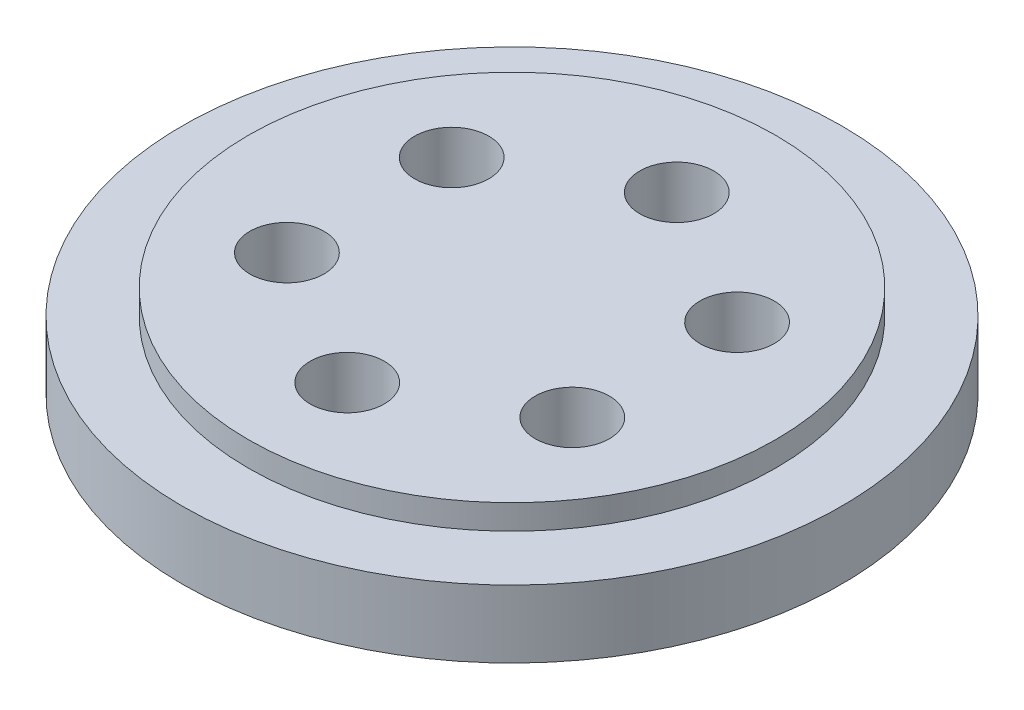
ISO-10303-21;
HEADER;
FILE_DESCRIPTION(('STEP AP214'),'2;1');
FILE_NAME('part.step','',(''),(''),'','','');
FILE_SCHEMA(('AUTOMOTIVE_DESIGN { 1 0 10303 214 1 1 1 1 }'));
ENDSEC;
DATA;
#1=APPLICATION_CONTEXT('core data for automotive mechanical design processes');
#2=APPLICATION_PROTOCOL_DEFINITION('international standard','automotive_design',2000,#1);
#3=PRODUCT_CONTEXT('',#1,'mechanical');
#4=PRODUCT('Part','Part','',(#3));
#5=PRODUCT_RELATED_PRODUCT_CATEGORY('part','',(#4));
#6=PRODUCT_DEFINITION_FORMATION('','',#4);
#7=PRODUCT_DEFINITION_CONTEXT('part definition',#1,'design');
#8=PRODUCT_DEFINITION('design','',#6,#7);
#9=PRODUCT_DEFINITION_SHAPE('','',#8);
#10=(LENGTH_UNIT() NAMED_UNIT(*) SI_UNIT(.MILLI.,.METRE.));
#11=(NAMED_UNIT(*) PLANE_ANGLE_UNIT() SI_UNIT($,.RADIAN.));
#12=(NAMED_UNIT(*) SI_UNIT($,.STERADIAN.) SOLID_ANGLE_UNIT());
#13=UNCERTAINTY_MEASURE_WITH_UNIT(LENGTH_MEASURE(1.E-05),#10,'distance_accuracy_value','');
#14=(GEOMETRIC_REPRESENTATION_CONTEXT(3) GLOBAL_UNCERTAINTY_ASSIGNED_CONTEXT((#13)) GLOBAL_UNIT_ASSIGNED_CONTEXT((#10,
#11,#12)) REPRESENTATION_CONTEXT('',''));
#15=CARTESIAN_POINT('',(0.,0.,0.));
#16=DIRECTION('',(0.,0.,1.));
#17=DIRECTION('',(1.,0.,0.));
#18=AXIS2_PLACEMENT_3D('',#15,#16,#17);
#19=CARTESIAN_POINT('',(0.,5.6,0.));
#20=DIRECTION('',(0.,-1.,0.));
#21=DIRECTION('',(0.,0.,-1.));
#22=AXIS2_PLACEMENT_3D('',#19,#20,#21);
#23=CYLINDRICAL_SURFACE('',#22,20.);
#24=CARTESIAN_POINT('',(0.,0.,0.));
#25=DIRECTION('',(0.,1.,0.));
#26=DIRECTION('',(0.,0.,1.));
#27=AXIS2_PLACEMENT_3D('',#24,#25,#26);
#28=CIRCLE('',#27,20.);
#29=CARTESIAN_POINT('',(0.,0.,20.));
#30=VERTEX_POINT('',#29);
#31=EDGE_CURVE('E10',#30,#30,#28,.T.);
#32=ORIENTED_EDGE('',*,*,#31,.T.);
#33=EDGE_LOOP('',(#32));
#34=FACE_BOUND('',#33,.T.);
#35=CARTESIAN_POINT('',(0.,4.1,0.));
#36=DIRECTION('',(0.,1.,0.));
#37=DIRECTION('',(0.,0.,1.));
#38=AXIS2_PLACEMENT_3D('',#35,#36,#37);
#39=CIRCLE('',#38,20.);
#40=CARTESIAN_POINT('',(0.,4.1,20.));
#41=VERTEX_POINT('',#40);
#42=EDGE_CURVE('E50',#41,#41,#39,.T.);
#43=ORIENTED_EDGE('',*,*,#42,.F.);
#44=EDGE_LOOP('',(#43));
#45=FACE_BOUND('',#44,.T.);
#46=ADVANCED_FACE('F43',(#34,#45),#23,.T.);
#47=CARTESIAN_POINT('',(0.,0.,0.));
#48=DIRECTION('',(0.,1.,0.));
#49=DIRECTION('',(0.,0.,1.));
#50=AXIS2_PLACEMENT_3D('',#47,#48,#49);
#51=PLANE('',#50);
#52=CARTESIAN_POINT('',(0.,0.,-10.));
#53=DIRECTION('',(0.,1.,0.));
#54=DIRECTION('',(0.,0.,1.));
#55=AXIS2_PLACEMENT_3D('',#52,#53,#54);
#56=CIRCLE('',#55,2.25);
#57=CARTESIAN_POINT('',(0.,0.,-7.75));
#58=VERTEX_POINT('',#57);
#59=EDGE_CURVE('E106',#58,#58,#56,.T.);
#60=ORIENTED_EDGE('',*,*,#59,.T.);
#61=EDGE_LOOP('',(#60));
#62=FACE_BOUND('',#61,.T.);
#63=CARTESIAN_POINT('',(8.66025403784467,0.,-5.00000000000049));
#64=DIRECTION('',(0.,1.,0.));
#65=DIRECTION('',(0.,0.,1.));
#66=AXIS2_PLACEMENT_3D('',#63,#64,#65);
#67=CIRCLE('',#66,2.25);
#68=CARTESIAN_POINT('',(8.66025403784467,0.,-2.75000000000049));
#69=VERTEX_POINT('',#68);
#70=EDGE_CURVE('E98',#69,#69,#67,.T.);
#71=ORIENTED_EDGE('',*,*,#70,.T.);
#72=EDGE_LOOP('',(#71));
#73=FACE_BOUND('',#72,.T.);
#74=CARTESIAN_POINT('',(8.66025403784524,0.,4.99999999999951));
#75=DIRECTION('',(0.,1.,0.));
#76=DIRECTION('',(0.,0.,1.));
#77=AXIS2_PLACEMENT_3D('',#74,#75,#76);
#78=CIRCLE('',#77,2.25);
#79=CARTESIAN_POINT('',(8.66025403784524,0.,7.24999999999951));
#80=VERTEX_POINT('',#79);
#81=EDGE_CURVE('E90',#80,#80,#78,.T.);
#82=ORIENTED_EDGE('',*,*,#81,.T.);
#83=EDGE_LOOP('',(#82));
#84=FACE_BOUND('',#83,.T.);
#85=CARTESIAN_POINT('',(1.13319443681872E-12,0.,10.));
#86=DIRECTION('',(0.,1.,0.));
#87=DIRECTION('',(0.,0.,1.));
#88=AXIS2_PLACEMENT_3D('',#85,#86,#87);
#89=CIRCLE('',#88,2.25);
#90=CARTESIAN_POINT('',(1.13319443681872E-12,0.,12.25));
#91=VERTEX_POINT('',#90);
#92=EDGE_CURVE('E82',#91,#91,#89,.T.);
#93=ORIENTED_EDGE('',*,*,#92,.T.);
#94=EDGE_LOOP('',(#93));
#95=FACE_BOUND('',#94,.T.);
#96=CARTESIAN_POINT('',(-8.66025403784354,0.,5.00000000000049));
#97=DIRECTION('',(0.,1.,0.));
#98=DIRECTION('',(0.,0.,1.));
#99=AXIS2_PLACEMENT_3D('',#96,#97,#98);
#100=CIRCLE('',#99,2.25);
#101=CARTESIAN_POINT('',(-8.66025403784354,0.,7.25000000000049));
#102=VERTEX_POINT('',#101);
#103=EDGE_CURVE('E74',#102,#102,#100,.T.);
#104=ORIENTED_EDGE('',*,*,#103,.T.);
#105=EDGE_LOOP('',(#104));
#106=FACE_BOUND('',#105,.T.);
#107=CARTESIAN_POINT('',(-8.6602540378441,0.,-4.99999999999951));
#108=DIRECTION('',(0.,1.,0.));
#109=DIRECTION('',(0.,0.,1.));
#110=AXIS2_PLACEMENT_3D('',#107,#108,#109);
#111=CIRCLE('',#110,2.25);
#112=CARTESIAN_POINT('',(-8.6602540378441,0.,-2.74999999999951));
#113=VERTEX_POINT('',#112);
#114=EDGE_CURVE('E65',#113,#113,#111,.T.);
#115=ORIENTED_EDGE('',*,*,#114,.T.);
#116=EDGE_LOOP('',(#115));
#117=FACE_BOUND('',#116,.T.);
#118=ORIENTED_EDGE('',*,*,#31,.F.);
#119=EDGE_LOOP('',(#118));
#120=FACE_BOUND('',#119,.T.);
#121=ADVANCED_FACE('F143',(#62,#73,#84,#95,#106,#117,#120),#51,.F.);
#122=CARTESIAN_POINT('',(0.,4.1,0.));
#123=DIRECTION('',(0.,1.,0.));
#124=DIRECTION('',(0.,0.,1.));
#125=AXIS2_PLACEMENT_3D('',#122,#123,#124);
#126=PLANE('',#125);
#127=CARTESIAN_POINT('',(0.,4.1,0.));
#128=DIRECTION('',(0.,1.,0.));
#129=DIRECTION('',(0.,0.,1.));
#130=AXIS2_PLACEMENT_3D('',#127,#128,#129);
#131=CIRCLE('',#130,16.);
#132=CARTESIAN_POINT('',(0.,4.1,16.));
#133=VERTEX_POINT('',#132);
#134=EDGE_CURVE('E55',#133,#133,#131,.T.);
#135=ORIENTED_EDGE('',*,*,#134,.F.);
#136=EDGE_LOOP('',(#135));
#137=FACE_BOUND('',#136,.T.);
#138=ORIENTED_EDGE('',*,*,#42,.T.);
#139=EDGE_LOOP('',(#138));
#140=FACE_BOUND('',#139,.T.);
#141=ADVANCED_FACE('F136',(#137,#140),#126,.T.);
#142=CARTESIAN_POINT('',(0.,4.1,0.));
#143=DIRECTION('',(0.,1.,0.));
#144=DIRECTION('',(0.,0.,1.));
#145=AXIS2_PLACEMENT_3D('',#142,#143,#144);
#146=CYLINDRICAL_SURFACE('',#145,16.);
#147=ORIENTED_EDGE('',*,*,#134,.T.);
#148=EDGE_LOOP('',(#147));
#149=FACE_BOUND('',#148,.T.);
#150=CARTESIAN_POINT('',(0.,5.6,0.));
#151=DIRECTION('',(0.,1.,0.));
#152=DIRECTION('',(0.,0.,1.));
#153=AXIS2_PLACEMENT_3D('',#150,#151,#152);
#154=CIRCLE('',#153,16.);
#155=CARTESIAN_POINT('',(0.,5.6,16.));
#156=VERTEX_POINT('',#155);
#157=EDGE_CURVE('E60',#156,#156,#154,.T.);
#158=ORIENTED_EDGE('',*,*,#157,.F.);
#159=EDGE_LOOP('',(#158));
#160=FACE_BOUND('',#159,.T.);
#161=ADVANCED_FACE('F121',(#149,#160),#146,.T.);
#162=CARTESIAN_POINT('',(0.,5.6,0.));
#163=DIRECTION('',(0.,1.,0.));
#164=DIRECTION('',(0.,0.,1.));
#165=AXIS2_PLACEMENT_3D('',#162,#163,#164);
#166=PLANE('',#165);
#167=CARTESIAN_POINT('',(0.,5.6,-10.));
#168=DIRECTION('',(0.,1.,0.));
#169=DIRECTION('',(0.,0.,1.));
#170=AXIS2_PLACEMENT_3D('',#167,#168,#169);
#171=CIRCLE('',#170,2.25);
#172=CARTESIAN_POINT('',(0.,5.6,-7.75));
#173=VERTEX_POINT('',#172);
#174=EDGE_CURVE('E110',#173,#173,#171,.T.);
#175=ORIENTED_EDGE('',*,*,#174,.F.);
#176=EDGE_LOOP('',(#175));
#177=FACE_BOUND('',#176,.T.);
#178=CARTESIAN_POINT('',(8.66025403784467,5.6,-5.00000000000049));
#179=DIRECTION('',(0.,1.,0.));
#180=DIRECTION('',(0.,0.,1.));
#181=AXIS2_PLACEMENT_3D('',#178,#179,#180);
#182=CIRCLE('',#181,2.25);
#183=CARTESIAN_POINT('',(8.66025403784467,5.6,-2.75000000000049));
#184=VERTEX_POINT('',#183);
#185=EDGE_CURVE('E102',#184,#184,#182,.T.);
#186=ORIENTED_EDGE('',*,*,#185,.F.);
#187=EDGE_LOOP('',(#186));
#188=FACE_BOUND('',#187,.T.);
#189=CARTESIAN_POINT('',(8.66025403784524,5.6,4.99999999999951));
#190=DIRECTION('',(0.,1.,0.));
#191=DIRECTION('',(0.,0.,1.));
#192=AXIS2_PLACEMENT_3D('',#189,#190,#191);
#193=CIRCLE('',#192,2.25);
#194=CARTESIAN_POINT('',(8.66025403784524,5.6,7.24999999999951));
#195=VERTEX_POINT('',#194);
#196=EDGE_CURVE('E94',#195,#195,#193,.T.);
#197=ORIENTED_EDGE('',*,*,#196,.F.);
#198=EDGE_LOOP('',(#197));
#199=FACE_BOUND('',#198,.T.);
#200=CARTESIAN_POINT('',(1.13319443681872E-12,5.6,10.));
#201=DIRECTION('',(0.,1.,0.));
#202=DIRECTION('',(0.,0.,1.));
#203=AXIS2_PLACEMENT_3D('',#200,#201,#202);
#204=CIRCLE('',#203,2.25);
#205=CARTESIAN_POINT('',(1.13319443681872E-12,5.6,12.25));
#206=VERTEX_POINT('',#205);
#207=EDGE_CURVE('E86',#206,#206,#204,.T.);
#208=ORIENTED_EDGE('',*,*,#207,.F.);
#209=EDGE_LOOP('',(#208));
#210=FACE_BOUND('',#209,.T.);
#211=CARTESIAN_POINT('',(-8.66025403784354,5.6,5.00000000000049));
#212=DIRECTION('',(0.,1.,0.));
#213=DIRECTION('',(0.,0.,1.));
#214=AXIS2_PLACEMENT_3D('',#211,#212,#213);
#215=CIRCLE('',#214,2.25);
#216=CARTESIAN_POINT('',(-8.66025403784354,5.6,7.25000000000049));
#217=VERTEX_POINT('',#216);
#218=EDGE_CURVE('E78',#217,#217,#215,.T.);
#219=ORIENTED_EDGE('',*,*,#218,.F.);
#220=EDGE_LOOP('',(#219));
#221=FACE_BOUND('',#220,.T.);
#222=CARTESIAN_POINT('',(-8.6602540378441,5.6,-4.99999999999951));
#223=DIRECTION('',(0.,1.,0.));
#224=DIRECTION('',(0.,0.,1.));
#225=AXIS2_PLACEMENT_3D('',#222,#223,#224);
#226=CIRCLE('',#225,2.25);
#227=CARTESIAN_POINT('',(-8.6602540378441,5.6,-2.74999999999951));
#228=VERTEX_POINT('',#227);
#229=EDGE_CURVE('E70',#228,#228,#226,.T.);
#230=ORIENTED_EDGE('',*,*,#229,.F.);
#231=EDGE_LOOP('',(#230));
#232=FACE_BOUND('',#231,.T.);
#233=ORIENTED_EDGE('',*,*,#157,.T.);
#234=EDGE_LOOP('',(#233));
#235=FACE_BOUND('',#234,.T.);
#236=ADVANCED_FACE('F117',(#177,#188,#199,#210,#221,#232,#235),#166,.T.);
#237=CARTESIAN_POINT('',(-8.6602540378441,5.6,-4.99999999999951));
#238=DIRECTION('',(0.,1.,0.));
#239=DIRECTION('',(0.,0.,1.));
#240=AXIS2_PLACEMENT_3D('',#237,#238,#239);
#241=CYLINDRICAL_SURFACE('',#240,2.25);
#242=ORIENTED_EDGE('',*,*,#114,.F.);
#243=EDGE_LOOP('',(#242));
#244=FACE_BOUND('',#243,.T.);
#245=ORIENTED_EDGE('',*,*,#229,.T.);
#246=EDGE_LOOP('',(#245));
#247=FACE_BOUND('',#246,.T.);
#248=ADVANCED_FACE('F120',(#244,#247),#241,.F.);
#249=CARTESIAN_POINT('',(-8.66025403784354,5.6,5.00000000000049));
#250=DIRECTION('',(0.,1.,0.));
#251=DIRECTION('',(0.,0.,1.));
#252=AXIS2_PLACEMENT_3D('',#249,#250,#251);
#253=CYLINDRICAL_SURFACE('',#252,2.25);
#254=ORIENTED_EDGE('',*,*,#103,.F.);
#255=EDGE_LOOP('',(#254));
#256=FACE_BOUND('',#255,.T.);
#257=ORIENTED_EDGE('',*,*,#218,.T.);
#258=EDGE_LOOP('',(#257));
#259=FACE_BOUND('',#258,.T.);
#260=ADVANCED_FACE('F169',(#256,#259),#253,.F.);
#261=CARTESIAN_POINT('',(1.13319443681872E-12,5.6,10.));
#262=DIRECTION('',(0.,1.,0.));
#263=DIRECTION('',(0.,0.,1.));
#264=AXIS2_PLACEMENT_3D('',#261,#262,#263);
#265=CYLINDRICAL_SURFACE('',#264,2.25);
#266=ORIENTED_EDGE('',*,*,#92,.F.);
#267=EDGE_LOOP('',(#266));
#268=FACE_BOUND('',#267,.T.);
#269=ORIENTED_EDGE('',*,*,#207,.T.);
#270=EDGE_LOOP('',(#269));
#271=FACE_BOUND('',#270,.T.);
#272=ADVANCED_FACE('F173',(#268,#271),#265,.F.);
#273=CARTESIAN_POINT('',(8.66025403784524,5.6,4.99999999999951));
#274=DIRECTION('',(0.,1.,0.));
#275=DIRECTION('',(0.,0.,1.));
#276=AXIS2_PLACEMENT_3D('',#273,#274,#275);
#277=CYLINDRICAL_SURFACE('',#276,2.25);
#278=ORIENTED_EDGE('',*,*,#81,.F.);
#279=EDGE_LOOP('',(#278));
#280=FACE_BOUND('',#279,.T.);
#281=ORIENTED_EDGE('',*,*,#196,.T.);
#282=EDGE_LOOP('',(#281));
#283=FACE_BOUND('',#282,.T.);
#284=ADVANCED_FACE('F179',(#280,#283),#277,.F.);
#285=CARTESIAN_POINT('',(8.66025403784467,5.6,-5.00000000000049));
#286=DIRECTION('',(0.,1.,0.));
#287=DIRECTION('',(0.,0.,1.));
#288=AXIS2_PLACEMENT_3D('',#285,#286,#287);
#289=CYLINDRICAL_SURFACE('',#288,2.25);
#290=ORIENTED_EDGE('',*,*,#70,.F.);
#291=EDGE_LOOP('',(#290));
#292=FACE_BOUND('',#291,.T.);
#293=ORIENTED_EDGE('',*,*,#185,.T.);
#294=EDGE_LOOP('',(#293));
#295=FACE_BOUND('',#294,.T.);
#296=ADVANCED_FACE('F183',(#292,#295),#289,.F.);
#297=CARTESIAN_POINT('',(0.,5.6,-10.));
#298=DIRECTION('',(0.,1.,0.));
#299=DIRECTION('',(0.,0.,1.));
#300=AXIS2_PLACEMENT_3D('',#297,#298,#299);
#301=CYLINDRICAL_SURFACE('',#300,2.25);
#302=ORIENTED_EDGE('',*,*,#59,.F.);
#303=EDGE_LOOP('',(#302));
#304=FACE_BOUND('',#303,.T.);
#305=ORIENTED_EDGE('',*,*,#174,.T.);
#306=EDGE_LOOP('',(#305));
#307=FACE_BOUND('',#306,.T.);
#308=ADVANCED_FACE('F115',(#304,#307),#301,.F.);
#309=CLOSED_SHELL('',(#46,#121,#141,#161,#236,#248,#260,#272,#284,#296,#308));
#310=MANIFOLD_SOLID_BREP('B2',#309);
#311=ADVANCED_BREP_SHAPE_REPRESENTATION('',(#18,#310),#14);
#312=SHAPE_DEFINITION_REPRESENTATION(#9,#311);
ENDSEC;
END-ISO-10303-21;
